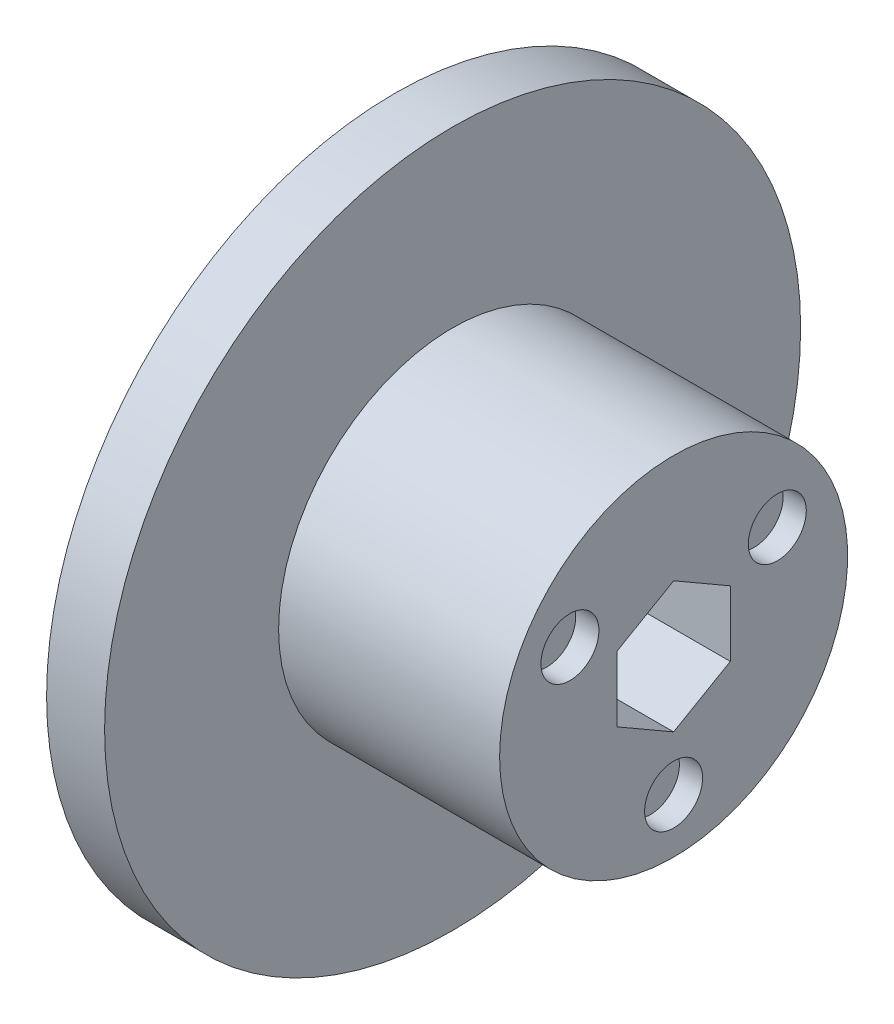
ISO-10303-21;
HEADER;
FILE_DESCRIPTION(('STEP AP214'),'2;1');
FILE_NAME('part.step','',(''),(''),'','','');
FILE_SCHEMA(('AUTOMOTIVE_DESIGN { 1 0 10303 214 1 1 1 1 }'));
ENDSEC;
DATA;
#1=APPLICATION_CONTEXT('core data for automotive mechanical design processes');
#2=APPLICATION_PROTOCOL_DEFINITION('international standard','automotive_design',2000,#1);
#3=PRODUCT_CONTEXT('',#1,'mechanical');
#4=PRODUCT('Part','Part','',(#3));
#5=PRODUCT_RELATED_PRODUCT_CATEGORY('part','',(#4));
#6=PRODUCT_DEFINITION_FORMATION('','',#4);
#7=PRODUCT_DEFINITION_CONTEXT('part definition',#1,'design');
#8=PRODUCT_DEFINITION('design','',#6,#7);
#9=PRODUCT_DEFINITION_SHAPE('','',#8);
#10=(LENGTH_UNIT() NAMED_UNIT(*) SI_UNIT(.MILLI.,.METRE.));
#11=(NAMED_UNIT(*) PLANE_ANGLE_UNIT() SI_UNIT($,.RADIAN.));
#12=(NAMED_UNIT(*) SI_UNIT($,.STERADIAN.) SOLID_ANGLE_UNIT());
#13=UNCERTAINTY_MEASURE_WITH_UNIT(LENGTH_MEASURE(1.E-05),#10,'distance_accuracy_value','');
#14=(GEOMETRIC_REPRESENTATION_CONTEXT(3) GLOBAL_UNCERTAINTY_ASSIGNED_CONTEXT((#13)) GLOBAL_UNIT_ASSIGNED_CONTEXT((#10,
#11,#12)) REPRESENTATION_CONTEXT('',''));
#15=CARTESIAN_POINT('',(0.,0.,0.));
#16=DIRECTION('',(0.,0.,1.));
#17=DIRECTION('',(1.,0.,0.));
#18=AXIS2_PLACEMENT_3D('',#15,#16,#17);
#19=CARTESIAN_POINT('',(5.,0.,0.));
#20=DIRECTION('',(-1.,0.,0.));
#21=DIRECTION('',(0.,0.,1.));
#22=AXIS2_PLACEMENT_3D('',#19,#20,#21);
#23=CYLINDRICAL_SURFACE('',#22,30.);
#24=CARTESIAN_POINT('',(5.,0.,0.));
#25=DIRECTION('',(1.,0.,0.));
#26=DIRECTION('',(0.,0.,-1.));
#27=AXIS2_PLACEMENT_3D('',#24,#25,#26);
#28=CIRCLE('',#27,30.);
#29=CARTESIAN_POINT('',(5.,0.,-30.));
#30=VERTEX_POINT('',#29);
#31=EDGE_CURVE('E48',#30,#30,#28,.T.);
#32=ORIENTED_EDGE('',*,*,#31,.F.);
#33=EDGE_LOOP('',(#32));
#34=FACE_BOUND('',#33,.T.);
#35=CARTESIAN_POINT('',(0.,0.,0.));
#36=DIRECTION('',(1.,0.,0.));
#37=DIRECTION('',(0.,0.,-1.));
#38=AXIS2_PLACEMENT_3D('',#35,#36,#37);
#39=CIRCLE('',#38,30.);
#40=CARTESIAN_POINT('',(0.,0.,-30.));
#41=VERTEX_POINT('',#40);
#42=EDGE_CURVE('E42',#41,#41,#39,.T.);
#43=ORIENTED_EDGE('',*,*,#42,.T.);
#44=EDGE_LOOP('',(#43));
#45=FACE_BOUND('',#44,.T.);
#46=ADVANCED_FACE('F39',(#34,#45),#23,.T.);
#47=CARTESIAN_POINT('',(5.,0.,0.));
#48=DIRECTION('',(1.,0.,0.));
#49=DIRECTION('',(0.,0.,-1.));
#50=AXIS2_PLACEMENT_3D('',#47,#48,#49);
#51=PLANE('',#50);
#52=CARTESIAN_POINT('',(5.,0.,0.));
#53=DIRECTION('',(1.,0.,0.));
#54=DIRECTION('',(0.,0.,-1.));
#55=AXIS2_PLACEMENT_3D('',#52,#53,#54);
#56=CIRCLE('',#55,15.);
#57=CARTESIAN_POINT('',(5.,0.,15.));
#58=VERTEX_POINT('',#57);
#59=EDGE_CURVE('E11',#58,#58,#56,.T.);
#60=ORIENTED_EDGE('',*,*,#59,.F.);
#61=EDGE_LOOP('',(#60));
#62=FACE_BOUND('',#61,.T.);
#63=ORIENTED_EDGE('',*,*,#31,.T.);
#64=EDGE_LOOP('',(#63));
#65=FACE_BOUND('',#64,.T.);
#66=ADVANCED_FACE('F163',(#62,#65),#51,.T.);
#67=CARTESIAN_POINT('',(0.,0.,0.));
#68=DIRECTION('',(1.,0.,0.));
#69=DIRECTION('',(0.,0.,-1.));
#70=AXIS2_PLACEMENT_3D('',#67,#68,#69);
#71=PLANE('',#70);
#72=DIRECTION('',(0.,-1.,0.));
#73=VECTOR('',#72,1.);
#74=CARTESIAN_POINT('',(0.,-2.82035606499132,-4.885));
#75=LINE('',#74,#73);
#76=CARTESIAN_POINT('',(0.,2.82035606499132,-4.885));
#77=VERTEX_POINT('',#76);
#78=CARTESIAN_POINT('',(0.,-2.82035606499132,-4.885));
#79=VERTEX_POINT('',#78);
#80=EDGE_CURVE('E355',#77,#79,#75,.T.);
#81=ORIENTED_EDGE('',*,*,#80,.F.);
#82=DIRECTION('',(0.,-0.5,-0.866025403784439));
#83=VECTOR('',#82,1.);
#84=CARTESIAN_POINT('',(0.,2.82035606499132,-4.885));
#85=LINE('',#84,#83);
#86=CARTESIAN_POINT('',(0.,5.64071212998264,0.));
#87=VERTEX_POINT('',#86);
#88=EDGE_CURVE('E148',#87,#77,#85,.T.);
#89=ORIENTED_EDGE('',*,*,#88,.F.);
#90=DIRECTION('',(0.,0.5,-0.866025403784439));
#91=VECTOR('',#90,1.);
#92=CARTESIAN_POINT('',(0.,5.64071212998264,0.));
#93=LINE('',#92,#91);
#94=CARTESIAN_POINT('',(0.,2.82035606499132,4.885));
#95=VERTEX_POINT('',#94);
#96=EDGE_CURVE('E144',#95,#87,#93,.T.);
#97=ORIENTED_EDGE('',*,*,#96,.F.);
#98=DIRECTION('',(0.,1.,0.));
#99=VECTOR('',#98,1.);
#100=CARTESIAN_POINT('',(0.,2.82035606499132,4.885));
#101=LINE('',#100,#99);
#102=CARTESIAN_POINT('',(0.,-2.82035606499132,4.885));
#103=VERTEX_POINT('',#102);
#104=EDGE_CURVE('E100',#103,#95,#101,.T.);
#105=ORIENTED_EDGE('',*,*,#104,.F.);
#106=DIRECTION('',(0.,0.5,0.866025403784439));
#107=VECTOR('',#106,1.);
#108=CARTESIAN_POINT('',(0.,-2.82035606499132,4.885));
#109=LINE('',#108,#107);
#110=CARTESIAN_POINT('',(0.,-5.64071212998264,0.));
#111=VERTEX_POINT('',#110);
#112=EDGE_CURVE('E349',#111,#103,#109,.T.);
#113=ORIENTED_EDGE('',*,*,#112,.F.);
#114=DIRECTION('',(0.,-0.5,0.866025403784439));
#115=VECTOR('',#114,1.);
#116=CARTESIAN_POINT('',(0.,-5.64071212998264,0.));
#117=LINE('',#116,#115);
#118=EDGE_CURVE('E352',#79,#111,#117,.T.);
#119=ORIENTED_EDGE('',*,*,#118,.F.);
#120=EDGE_LOOP('',(#81,#89,#97,#105,#113,#119));
#121=FACE_BOUND('',#120,.T.);
#122=ORIENTED_EDGE('',*,*,#42,.F.);
#123=EDGE_LOOP('',(#122));
#124=FACE_BOUND('',#123,.T.);
#125=ADVANCED_FACE('F160',(#121,#124),#71,.F.);
#126=CARTESIAN_POINT('',(24.05,0.,0.));
#127=DIRECTION('',(-1.,0.,0.));
#128=DIRECTION('',(0.,0.,1.));
#129=AXIS2_PLACEMENT_3D('',#126,#127,#128);
#130=CYLINDRICAL_SURFACE('',#129,15.);
#131=CARTESIAN_POINT('',(24.05,0.,0.));
#132=DIRECTION('',(1.,0.,0.));
#133=DIRECTION('',(0.,0.,-1.));
#134=AXIS2_PLACEMENT_3D('',#131,#132,#133);
#135=CIRCLE('',#134,15.);
#136=CARTESIAN_POINT('',(24.05,0.,15.));
#137=VERTEX_POINT('',#136);
#138=EDGE_CURVE('E147',#137,#137,#135,.T.);
#139=CARTESIAN_POINT('',(24.05,0.,15.));
#140=CARTESIAN_POINT('',(23.8515625,0.,15.));
#141=CARTESIAN_POINT('',(23.653125,0.,15.));
#142=CARTESIAN_POINT('',(23.25625,0.,15.));
#143=CARTESIAN_POINT('',(23.0578125,0.,15.));
#144=CARTESIAN_POINT('',(22.6609375,0.,15.));
#145=CARTESIAN_POINT('',(22.4625,0.,15.));
#146=CARTESIAN_POINT('',(22.065625,0.,15.));
#147=CARTESIAN_POINT('',(21.8671875,0.,15.));
#148=CARTESIAN_POINT('',(21.4703125,0.,15.));
#149=CARTESIAN_POINT('',(21.271875,0.,15.));
#150=CARTESIAN_POINT('',(20.875,0.,15.));
#151=CARTESIAN_POINT('',(20.6765625,0.,15.));
#152=CARTESIAN_POINT('',(20.2796875,0.,15.));
#153=CARTESIAN_POINT('',(20.08125,0.,15.));
#154=CARTESIAN_POINT('',(19.684375,0.,15.));
#155=CARTESIAN_POINT('',(19.4859375,0.,15.));
#156=CARTESIAN_POINT('',(19.0890625,0.,15.));
#157=CARTESIAN_POINT('',(18.890625,0.,15.));
#158=CARTESIAN_POINT('',(18.49375,0.,15.));
#159=CARTESIAN_POINT('',(18.2953125,0.,15.));
#160=CARTESIAN_POINT('',(17.8984375,0.,15.));
#161=CARTESIAN_POINT('',(17.7,0.,15.));
#162=CARTESIAN_POINT('',(17.303125,0.,15.));
#163=CARTESIAN_POINT('',(17.1046875,0.,15.));
#164=CARTESIAN_POINT('',(16.7078125,0.,15.));
#165=CARTESIAN_POINT('',(16.509375,0.,15.));
#166=CARTESIAN_POINT('',(16.1125,0.,15.));
#167=CARTESIAN_POINT('',(15.9140625,0.,15.));
#168=CARTESIAN_POINT('',(15.5171875,0.,15.));
#169=CARTESIAN_POINT('',(15.31875,0.,15.));
#170=CARTESIAN_POINT('',(14.921875,0.,15.));
#171=CARTESIAN_POINT('',(14.7234375,0.,15.));
#172=CARTESIAN_POINT('',(14.3265625,0.,15.));
#173=CARTESIAN_POINT('',(14.128125,0.,15.));
#174=CARTESIAN_POINT('',(13.73125,0.,15.));
#175=CARTESIAN_POINT('',(13.5328125,0.,15.));
#176=CARTESIAN_POINT('',(13.1359375,0.,15.));
#177=CARTESIAN_POINT('',(12.9375,0.,15.));
#178=CARTESIAN_POINT('',(12.540625,0.,15.));
#179=CARTESIAN_POINT('',(12.3421875,0.,15.));
#180=CARTESIAN_POINT('',(11.9453125,0.,15.));
#181=CARTESIAN_POINT('',(11.746875,0.,15.));
#182=CARTESIAN_POINT('',(11.35,0.,15.));
#183=CARTESIAN_POINT('',(11.1515625,0.,15.));
#184=CARTESIAN_POINT('',(10.7546875,0.,15.));
#185=CARTESIAN_POINT('',(10.55625,0.,15.));
#186=CARTESIAN_POINT('',(10.159375,0.,15.));
#187=CARTESIAN_POINT('',(9.9609375,0.,15.));
#188=CARTESIAN_POINT('',(9.5640625,0.,15.));
#189=CARTESIAN_POINT('',(9.365625,0.,15.));
#190=CARTESIAN_POINT('',(8.96875,0.,15.));
#191=CARTESIAN_POINT('',(8.7703125,0.,15.));
#192=CARTESIAN_POINT('',(8.3734375,0.,15.));
#193=CARTESIAN_POINT('',(8.175,0.,15.));
#194=CARTESIAN_POINT('',(7.778125,0.,15.));
#195=CARTESIAN_POINT('',(7.5796875,0.,15.));
#196=CARTESIAN_POINT('',(7.1828125,0.,15.));
#197=CARTESIAN_POINT('',(6.984375,0.,15.));
#198=CARTESIAN_POINT('',(6.5875,0.,15.));
#199=CARTESIAN_POINT('',(6.3890625,0.,15.));
#200=CARTESIAN_POINT('',(5.9921875,0.,15.));
#201=CARTESIAN_POINT('',(5.79375,0.,15.));
#202=CARTESIAN_POINT('',(5.396875,0.,15.));
#203=CARTESIAN_POINT('',(5.1984375,0.,15.));
#204=CARTESIAN_POINT('',(5.,0.,15.));
#205=B_SPLINE_CURVE_WITH_KNOTS('',3,(#139,#140,#141,#142,#143,#144,#145,#146,#147,#148,#149,
#150,#151,#152,#153,#154,#155,#156,#157,#158,#159,#160,#161,#162,#163,#164,#165,#166,#167,#168,
#169,#170,#171,#172,#173,#174,#175,#176,#177,#178,#179,#180,#181,#182,#183,#184,#185,#186,#187,
#188,#189,#190,#191,#192,#193,#194,#195,#196,#197,#198,#199,#200,#201,#202,#203,#204),
.UNSPECIFIED.,.F.,.F.,(4,2,2,2,2,2,2,2,2,2,2,2,2,2,2,2,2,2,2,2,2,2,2,2,2,2,2,2,2,2,2,2,4),(0.,
0.5953125,1.190625,1.7859375,2.38125,2.9765625,3.571875,4.1671875,4.7625,5.3578125,5.953125,
6.5484375,7.14375,7.7390625,8.334375,8.9296875,9.525,10.1203125,10.715625,11.3109375,11.90625,
12.5015625,13.096875,13.6921875,14.2875,14.8828125,15.478125,16.0734375,16.66875,17.2640625,
17.859375,18.4546875,19.05),.UNSPECIFIED.);
#206=EDGE_CURVE('BSEAM162',#137,#58,#205,.T.);
#207=ORIENTED_EDGE('',*,*,#138,.F.);
#208=ORIENTED_EDGE('',*,*,#59,.T.);
#209=ORIENTED_EDGE('',*,*,#206,.T.);
#210=ORIENTED_EDGE('',*,*,#206,.F.);
#211=EDGE_LOOP('',(#207,#209,#208,#210));
#212=FACE_BOUND('',#211,.T.);
#213=ADVANCED_FACE('F162',(#212),#130,.T.);
#214=CARTESIAN_POINT('',(24.05,0.,0.));
#215=DIRECTION('',(1.,0.,0.));
#216=DIRECTION('',(0.,0.,-1.));
#217=AXIS2_PLACEMENT_3D('',#214,#215,#216);
#218=PLANE('',#217);
#219=CARTESIAN_POINT('',(24.05,-10.3203560649913,0.));
#220=DIRECTION('',(1.,0.,0.));
#221=DIRECTION('',(0.,0.,-1.));
#222=AXIS2_PLACEMENT_3D('',#219,#220,#221);
#223=CIRCLE('',#222,2.5);
#224=CARTESIAN_POINT('',(24.05,-10.3203560649913,-2.5));
#225=VERTEX_POINT('',#224);
#226=EDGE_CURVE('E324',#225,#225,#223,.T.);
#227=ORIENTED_EDGE('',*,*,#226,.F.);
#228=EDGE_LOOP('',(#227));
#229=FACE_BOUND('',#228,.T.);
#230=CARTESIAN_POINT('',(24.05,5.16017803249567,-8.93769052838329));
#231=DIRECTION('',(1.,0.,0.));
#232=DIRECTION('',(0.,0.,-1.));
#233=AXIS2_PLACEMENT_3D('',#230,#231,#232);
#234=CIRCLE('',#233,2.5);
#235=CARTESIAN_POINT('',(24.05,5.16017803249567,-11.4376905283833));
#236=VERTEX_POINT('',#235);
#237=EDGE_CURVE('E335',#236,#236,#234,.T.);
#238=ORIENTED_EDGE('',*,*,#237,.F.);
#239=EDGE_LOOP('',(#238));
#240=FACE_BOUND('',#239,.T.);
#241=CARTESIAN_POINT('',(24.05,5.16017803249566,8.93769052838329));
#242=DIRECTION('',(1.,0.,0.));
#243=DIRECTION('',(0.,0.,-1.));
#244=AXIS2_PLACEMENT_3D('',#241,#242,#243);
#245=CIRCLE('',#244,2.5);
#246=CARTESIAN_POINT('',(24.05,5.16017803249566,6.43769052838329));
#247=VERTEX_POINT('',#246);
#248=EDGE_CURVE('E343',#247,#247,#245,.T.);
#249=ORIENTED_EDGE('',*,*,#248,.F.);
#250=EDGE_LOOP('',(#249));
#251=FACE_BOUND('',#250,.T.);
#252=DIRECTION('',(0.,0.5,0.866025403784439));
#253=VECTOR('',#252,1.);
#254=CARTESIAN_POINT('',(24.05,2.82035606499132,-4.885));
#255=LINE('',#254,#253);
#256=CARTESIAN_POINT('',(24.05,2.82035606499132,-4.885));
#257=VERTEX_POINT('',#256);
#258=CARTESIAN_POINT('',(24.05,5.64071212998264,0.));
#259=VERTEX_POINT('',#258);
#260=EDGE_CURVE('E64',#257,#259,#255,.T.);
#261=ORIENTED_EDGE('',*,*,#260,.F.);
#262=DIRECTION('',(0.,1.,0.));
#263=VECTOR('',#262,1.);
#264=CARTESIAN_POINT('',(24.05,-2.82035606499132,-4.885));
#265=LINE('',#264,#263);
#266=CARTESIAN_POINT('',(24.05,-2.82035606499132,-4.885));
#267=VERTEX_POINT('',#266);
#268=EDGE_CURVE('E127',#267,#257,#265,.T.);
#269=ORIENTED_EDGE('',*,*,#268,.F.);
#270=DIRECTION('',(0.,0.5,-0.866025403784439));
#271=VECTOR('',#270,1.);
#272=CARTESIAN_POINT('',(24.05,-5.64071212998264,0.));
#273=LINE('',#272,#271);
#274=CARTESIAN_POINT('',(24.05,-5.64071212998264,0.));
#275=VERTEX_POINT('',#274);
#276=EDGE_CURVE('E120',#275,#267,#273,.T.);
#277=ORIENTED_EDGE('',*,*,#276,.F.);
#278=DIRECTION('',(0.,-0.5,-0.866025403784439));
#279=VECTOR('',#278,1.);
#280=CARTESIAN_POINT('',(24.05,-2.82035606499132,4.885));
#281=LINE('',#280,#279);
#282=CARTESIAN_POINT('',(24.05,-2.82035606499132,4.885));
#283=VERTEX_POINT('',#282);
#284=EDGE_CURVE('E116',#283,#275,#281,.T.);
#285=ORIENTED_EDGE('',*,*,#284,.F.);
#286=DIRECTION('',(0.,-1.,0.));
#287=VECTOR('',#286,1.);
#288=CARTESIAN_POINT('',(24.05,2.82035606499132,4.885));
#289=LINE('',#288,#287);
#290=CARTESIAN_POINT('',(24.05,2.82035606499132,4.885));
#291=VERTEX_POINT('',#290);
#292=EDGE_CURVE('E97',#291,#283,#289,.T.);
#293=ORIENTED_EDGE('',*,*,#292,.F.);
#294=DIRECTION('',(0.,-0.5,0.866025403784439));
#295=VECTOR('',#294,1.);
#296=CARTESIAN_POINT('',(24.05,5.64071212998264,0.));
#297=LINE('',#296,#295);
#298=EDGE_CURVE('E107',#259,#291,#297,.T.);
#299=ORIENTED_EDGE('',*,*,#298,.F.);
#300=EDGE_LOOP('',(#261,#269,#277,#285,#293,#299));
#301=FACE_BOUND('',#300,.T.);
#302=ORIENTED_EDGE('',*,*,#138,.T.);
#303=EDGE_LOOP('',(#302));
#304=FACE_BOUND('',#303,.T.);
#305=ADVANCED_FACE('F112',(#229,#240,#251,#301,#304),#218,.T.);
#306=CARTESIAN_POINT('',(-14.9239215132395,2.82035606499132,-4.885));
#307=DIRECTION('',(0.,0.866025403784439,-0.5));
#308=DIRECTION('',(0.,0.5,0.866025403784439));
#309=AXIS2_PLACEMENT_3D('',#306,#307,#308);
#310=PLANE('',#309);
#311=ORIENTED_EDGE('',*,*,#88,.T.);
#312=DIRECTION('',(1.,0.,0.));
#313=VECTOR('',#312,1.);
#314=CARTESIAN_POINT('',(-14.9239215132395,2.82035606499132,-4.885));
#315=LINE('',#314,#313);
#316=EDGE_CURVE('E131',#77,#257,#315,.T.);
#317=ORIENTED_EDGE('',*,*,#316,.T.);
#318=ORIENTED_EDGE('',*,*,#260,.T.);
#319=DIRECTION('',(1.,0.,0.));
#320=VECTOR('',#319,1.);
#321=CARTESIAN_POINT('',(-14.9239215132395,5.64071212998264,0.));
#322=LINE('',#321,#320);
#323=EDGE_CURVE('E104',#87,#259,#322,.T.);
#324=ORIENTED_EDGE('',*,*,#323,.F.);
#325=EDGE_LOOP('',(#311,#317,#318,#324));
#326=FACE_BOUND('',#325,.T.);
#327=ADVANCED_FACE('F199',(#326),#310,.F.);
#328=CARTESIAN_POINT('',(-14.9239215132395,-2.82035606499132,-4.885));
#329=DIRECTION('',(0.,0.,-1.));
#330=DIRECTION('',(0.,1.,0.));
#331=AXIS2_PLACEMENT_3D('',#328,#329,#330);
#332=PLANE('',#331);
#333=ORIENTED_EDGE('',*,*,#80,.T.);
#334=DIRECTION('',(1.,0.,0.));
#335=VECTOR('',#334,1.);
#336=CARTESIAN_POINT('',(-14.9239215132395,-2.82035606499132,-4.885));
#337=LINE('',#336,#335);
#338=EDGE_CURVE('E134',#79,#267,#337,.T.);
#339=ORIENTED_EDGE('',*,*,#338,.T.);
#340=ORIENTED_EDGE('',*,*,#268,.T.);
#341=ORIENTED_EDGE('',*,*,#316,.F.);
#342=EDGE_LOOP('',(#333,#339,#340,#341));
#343=FACE_BOUND('',#342,.T.);
#344=ADVANCED_FACE('F204',(#343),#332,.F.);
#345=CARTESIAN_POINT('',(-14.9239215132395,-5.64071212998264,0.));
#346=DIRECTION('',(0.,-0.866025403784439,-0.5));
#347=DIRECTION('',(0.,0.5,-0.866025403784439));
#348=AXIS2_PLACEMENT_3D('',#345,#346,#347);
#349=PLANE('',#348);
#350=ORIENTED_EDGE('',*,*,#118,.T.);
#351=DIRECTION('',(1.,0.,0.));
#352=VECTOR('',#351,1.);
#353=CARTESIAN_POINT('',(-14.9239215132395,-5.64071212998264,0.));
#354=LINE('',#353,#352);
#355=EDGE_CURVE('E137',#111,#275,#354,.T.);
#356=ORIENTED_EDGE('',*,*,#355,.T.);
#357=ORIENTED_EDGE('',*,*,#276,.T.);
#358=ORIENTED_EDGE('',*,*,#338,.F.);
#359=EDGE_LOOP('',(#350,#356,#357,#358));
#360=FACE_BOUND('',#359,.T.);
#361=ADVANCED_FACE('F213',(#360),#349,.F.);
#362=CARTESIAN_POINT('',(-14.9239215132395,-2.82035606499132,4.885));
#363=DIRECTION('',(0.,-0.866025403784439,0.5));
#364=DIRECTION('',(0.,-0.5,-0.866025403784439));
#365=AXIS2_PLACEMENT_3D('',#362,#363,#364);
#366=PLANE('',#365);
#367=ORIENTED_EDGE('',*,*,#112,.T.);
#368=DIRECTION('',(1.,0.,0.));
#369=VECTOR('',#368,1.);
#370=CARTESIAN_POINT('',(-14.9239215132395,-2.82035606499132,4.885));
#371=LINE('',#370,#369);
#372=EDGE_CURVE('E103',#103,#283,#371,.T.);
#373=ORIENTED_EDGE('',*,*,#372,.T.);
#374=ORIENTED_EDGE('',*,*,#284,.T.);
#375=ORIENTED_EDGE('',*,*,#355,.F.);
#376=EDGE_LOOP('',(#367,#373,#374,#375));
#377=FACE_BOUND('',#376,.T.);
#378=ADVANCED_FACE('F223',(#377),#366,.F.);
#379=CARTESIAN_POINT('',(-14.9239215132395,2.82035606499132,4.885));
#380=DIRECTION('',(0.,0.,1.));
#381=DIRECTION('',(0.,-1.,0.));
#382=AXIS2_PLACEMENT_3D('',#379,#380,#381);
#383=PLANE('',#382);
#384=ORIENTED_EDGE('',*,*,#104,.T.);
#385=DIRECTION('',(1.,0.,0.));
#386=VECTOR('',#385,1.);
#387=CARTESIAN_POINT('',(-14.9239215132395,2.82035606499132,4.885));
#388=LINE('',#387,#386);
#389=EDGE_CURVE('E56',#95,#291,#388,.T.);
#390=ORIENTED_EDGE('',*,*,#389,.T.);
#391=ORIENTED_EDGE('',*,*,#292,.T.);
#392=ORIENTED_EDGE('',*,*,#372,.F.);
#393=EDGE_LOOP('',(#384,#390,#391,#392));
#394=FACE_BOUND('',#393,.T.);
#395=ADVANCED_FACE('F94',(#394),#383,.F.);
#396=CARTESIAN_POINT('',(-14.9239215132395,5.64071212998264,0.));
#397=DIRECTION('',(0.,0.866025403784439,0.5));
#398=DIRECTION('',(0.,-0.5,0.866025403784439));
#399=AXIS2_PLACEMENT_3D('',#396,#397,#398);
#400=PLANE('',#399);
#401=ORIENTED_EDGE('',*,*,#96,.T.);
#402=ORIENTED_EDGE('',*,*,#323,.T.);
#403=ORIENTED_EDGE('',*,*,#298,.T.);
#404=ORIENTED_EDGE('',*,*,#389,.F.);
#405=EDGE_LOOP('',(#401,#402,#403,#404));
#406=FACE_BOUND('',#405,.T.);
#407=ADVANCED_FACE('F108',(#406),#400,.F.);
#408=CARTESIAN_POINT('',(22.05,5.16017803249566,8.93769052838329));
#409=DIRECTION('',(1.,0.,0.));
#410=DIRECTION('',(0.,0.,-1.));
#411=AXIS2_PLACEMENT_3D('',#408,#409,#410);
#412=CYLINDRICAL_SURFACE('',#411,2.5);
#413=CARTESIAN_POINT('',(22.05,5.16017803249566,8.93769052838329));
#414=DIRECTION('',(1.,0.,0.));
#415=DIRECTION('',(0.,0.,-1.));
#416=AXIS2_PLACEMENT_3D('',#413,#414,#415);
#417=CIRCLE('',#416,2.5);
#418=CARTESIAN_POINT('',(22.05,5.16017803249566,6.43769052838329));
#419=VERTEX_POINT('',#418);
#420=EDGE_CURVE('E339',#419,#419,#417,.T.);
#421=ORIENTED_EDGE('',*,*,#420,.F.);
#422=EDGE_LOOP('',(#421));
#423=FACE_BOUND('',#422,.T.);
#424=ORIENTED_EDGE('',*,*,#248,.T.);
#425=EDGE_LOOP('',(#424));
#426=FACE_BOUND('',#425,.T.);
#427=ADVANCED_FACE('F250',(#423,#426),#412,.F.);
#428=CARTESIAN_POINT('',(22.05,5.16017803249566,8.93769052838329));
#429=DIRECTION('',(1.,0.,0.));
#430=DIRECTION('',(0.,0.,-1.));
#431=AXIS2_PLACEMENT_3D('',#428,#429,#430);
#432=PLANE('',#431);
#433=ORIENTED_EDGE('',*,*,#420,.T.);
#434=EDGE_LOOP('',(#433));
#435=FACE_BOUND('',#434,.T.);
#436=ADVANCED_FACE('F266',(#435),#432,.T.);
#437=CARTESIAN_POINT('',(22.05,5.16017803249567,-8.93769052838329));
#438=DIRECTION('',(1.,0.,0.));
#439=DIRECTION('',(0.,0.,-1.));
#440=AXIS2_PLACEMENT_3D('',#437,#438,#439);
#441=CYLINDRICAL_SURFACE('',#440,2.5);
#442=CARTESIAN_POINT('',(22.05,5.16017803249567,-8.93769052838329));
#443=DIRECTION('',(1.,0.,0.));
#444=DIRECTION('',(0.,0.,-1.));
#445=AXIS2_PLACEMENT_3D('',#442,#443,#444);
#446=CIRCLE('',#445,2.5);
#447=CARTESIAN_POINT('',(22.05,5.16017803249567,-11.4376905283833));
#448=VERTEX_POINT('',#447);
#449=EDGE_CURVE('E329',#448,#448,#446,.T.);
#450=ORIENTED_EDGE('',*,*,#449,.F.);
#451=EDGE_LOOP('',(#450));
#452=FACE_BOUND('',#451,.T.);
#453=ORIENTED_EDGE('',*,*,#237,.T.);
#454=EDGE_LOOP('',(#453));
#455=FACE_BOUND('',#454,.T.);
#456=ADVANCED_FACE('F276',(#452,#455),#441,.F.);
#457=CARTESIAN_POINT('',(22.05,5.16017803249567,-8.93769052838329));
#458=DIRECTION('',(1.,0.,0.));
#459=DIRECTION('',(0.,0.,-1.));
#460=AXIS2_PLACEMENT_3D('',#457,#458,#459);
#461=PLANE('',#460);
#462=ORIENTED_EDGE('',*,*,#449,.T.);
#463=EDGE_LOOP('',(#462));
#464=FACE_BOUND('',#463,.T.);
#465=ADVANCED_FACE('F286',(#464),#461,.T.);
#466=CARTESIAN_POINT('',(22.05,-10.3203560649913,0.));
#467=DIRECTION('',(1.,0.,0.));
#468=DIRECTION('',(0.,0.,-1.));
#469=AXIS2_PLACEMENT_3D('',#466,#467,#468);
#470=CYLINDRICAL_SURFACE('',#469,2.5);
#471=CARTESIAN_POINT('',(22.05,-10.3203560649913,0.));
#472=DIRECTION('',(1.,0.,0.));
#473=DIRECTION('',(0.,0.,-1.));
#474=AXIS2_PLACEMENT_3D('',#471,#472,#473);
#475=CIRCLE('',#474,2.5);
#476=CARTESIAN_POINT('',(22.05,-10.3203560649913,-2.5));
#477=VERTEX_POINT('',#476);
#478=EDGE_CURVE('E322',#477,#477,#475,.T.);
#479=ORIENTED_EDGE('',*,*,#478,.F.);
#480=EDGE_LOOP('',(#479));
#481=FACE_BOUND('',#480,.T.);
#482=ORIENTED_EDGE('',*,*,#226,.T.);
#483=EDGE_LOOP('',(#482));
#484=FACE_BOUND('',#483,.T.);
#485=ADVANCED_FACE('F296',(#481,#484),#470,.F.);
#486=CARTESIAN_POINT('',(22.05,-10.3203560649913,0.));
#487=DIRECTION('',(1.,0.,0.));
#488=DIRECTION('',(0.,0.,-1.));
#489=AXIS2_PLACEMENT_3D('',#486,#487,#488);
#490=PLANE('',#489);
#491=ORIENTED_EDGE('',*,*,#478,.T.);
#492=EDGE_LOOP('',(#491));
#493=FACE_BOUND('',#492,.T.);
#494=ADVANCED_FACE('F306',(#493),#490,.T.);
#495=CLOSED_SHELL('',(#46,#66,#125,#213,#305,#327,#344,#361,#378,#395,#407,#427,#436,#456,#465,
#485,#494));
#496=MANIFOLD_SOLID_BREP('B2',#495);
#497=ADVANCED_BREP_SHAPE_REPRESENTATION('',(#18,#496),#14);
#498=SHAPE_DEFINITION_REPRESENTATION(#9,#497);
ENDSEC;
END-ISO-10303-21;
